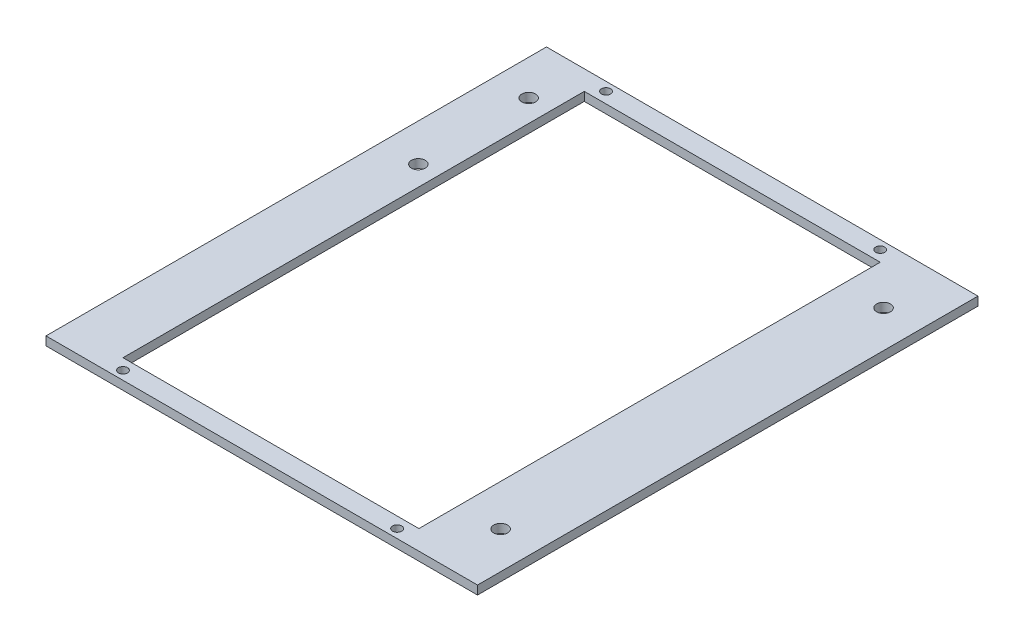
ISO-10303-21;
HEADER;
FILE_DESCRIPTION(('STEP AP214'),'2;1');
FILE_NAME('part.step','',(''),(''),'','','');
FILE_SCHEMA(('AUTOMOTIVE_DESIGN { 1 0 10303 214 1 1 1 1 }'));
ENDSEC;
DATA;
#1=APPLICATION_CONTEXT('core data for automotive mechanical design processes');
#2=APPLICATION_PROTOCOL_DEFINITION('international standard','automotive_design',2000,#1);
#3=PRODUCT_CONTEXT('',#1,'mechanical');
#4=PRODUCT('Part','Part','',(#3));
#5=PRODUCT_RELATED_PRODUCT_CATEGORY('part','',(#4));
#6=PRODUCT_DEFINITION_FORMATION('','',#4);
#7=PRODUCT_DEFINITION_CONTEXT('part definition',#1,'design');
#8=PRODUCT_DEFINITION('design','',#6,#7);
#9=PRODUCT_DEFINITION_SHAPE('','',#8);
#10=(LENGTH_UNIT() NAMED_UNIT(*) SI_UNIT(.MILLI.,.METRE.));
#11=(NAMED_UNIT(*) PLANE_ANGLE_UNIT() SI_UNIT($,.RADIAN.));
#12=(NAMED_UNIT(*) SI_UNIT($,.STERADIAN.) SOLID_ANGLE_UNIT());
#13=UNCERTAINTY_MEASURE_WITH_UNIT(LENGTH_MEASURE(1.E-05),#10,'distance_accuracy_value','');
#14=(GEOMETRIC_REPRESENTATION_CONTEXT(3) GLOBAL_UNCERTAINTY_ASSIGNED_CONTEXT((#13)) GLOBAL_UNIT_ASSIGNED_CONTEXT((#10,
#11,#12)) REPRESENTATION_CONTEXT('',''));
#15=CARTESIAN_POINT('',(0.,0.,0.));
#16=DIRECTION('',(0.,0.,1.));
#17=DIRECTION('',(1.,0.,0.));
#18=AXIS2_PLACEMENT_3D('',#15,#16,#17);
#19=CARTESIAN_POINT('',(0.,2.,4.5));
#20=DIRECTION('',(0.,0.,-1.));
#21=DIRECTION('',(-1.,0.,0.));
#22=AXIS2_PLACEMENT_3D('',#19,#20,#21);
#23=PLANE('',#22);
#24=DIRECTION('',(1.,0.,0.));
#25=VECTOR('',#24,1.);
#26=CARTESIAN_POINT('',(0.,0.,4.5));
#27=LINE('',#26,#25);
#28=CARTESIAN_POINT('',(13.19,0.,4.5));
#29=VERTEX_POINT('',#28);
#30=CARTESIAN_POINT('',(81.19,0.,4.5));
#31=VERTEX_POINT('',#30);
#32=EDGE_CURVE('E191',#29,#31,#27,.T.);
#33=ORIENTED_EDGE('',*,*,#32,.T.);
#34=DIRECTION('',(0.,-1.,0.));
#35=VECTOR('',#34,1.);
#36=CARTESIAN_POINT('',(81.19,2.,4.5));
#37=LINE('',#36,#35);
#38=CARTESIAN_POINT('',(81.19,2.,4.5));
#39=VERTEX_POINT('',#38);
#40=EDGE_CURVE('E11',#39,#31,#37,.T.);
#41=ORIENTED_EDGE('',*,*,#40,.F.);
#42=DIRECTION('',(1.,0.,0.));
#43=VECTOR('',#42,1.);
#44=CARTESIAN_POINT('',(0.,2.,4.5));
#45=LINE('',#44,#43);
#46=CARTESIAN_POINT('',(13.19,2.,4.5));
#47=VERTEX_POINT('',#46);
#48=EDGE_CURVE('E122',#47,#39,#45,.T.);
#49=ORIENTED_EDGE('',*,*,#48,.F.);
#50=DIRECTION('',(0.,-1.,0.));
#51=VECTOR('',#50,1.);
#52=CARTESIAN_POINT('',(13.19,2.,4.5));
#53=LINE('',#52,#51);
#54=EDGE_CURVE('E61',#47,#29,#53,.T.);
#55=ORIENTED_EDGE('',*,*,#54,.T.);
#56=EDGE_LOOP('',(#33,#41,#49,#55));
#57=FACE_BOUND('',#56,.T.);
#58=ADVANCED_FACE('F41',(#57),#23,.F.);
#59=CARTESIAN_POINT('',(81.19,2.,0.));
#60=DIRECTION('',(1.,0.,0.));
#61=DIRECTION('',(0.,0.,-1.));
#62=AXIS2_PLACEMENT_3D('',#59,#60,#61);
#63=PLANE('',#62);
#64=DIRECTION('',(0.,0.,1.));
#65=VECTOR('',#64,1.);
#66=CARTESIAN_POINT('',(81.19,0.,0.));
#67=LINE('',#66,#65);
#68=CARTESIAN_POINT('',(81.19,0.,110.5));
#69=VERTEX_POINT('',#68);
#70=EDGE_CURVE('E129',#31,#69,#67,.T.);
#71=ORIENTED_EDGE('',*,*,#70,.T.);
#72=DIRECTION('',(0.,-1.,0.));
#73=VECTOR('',#72,1.);
#74=CARTESIAN_POINT('',(81.19,2.,110.5));
#75=LINE('',#74,#73);
#76=CARTESIAN_POINT('',(81.19,2.,110.5));
#77=VERTEX_POINT('',#76);
#78=EDGE_CURVE('E52',#77,#69,#75,.T.);
#79=ORIENTED_EDGE('',*,*,#78,.F.);
#80=DIRECTION('',(0.,0.,1.));
#81=VECTOR('',#80,1.);
#82=CARTESIAN_POINT('',(81.19,2.,0.));
#83=LINE('',#82,#81);
#84=EDGE_CURVE('E115',#39,#77,#83,.T.);
#85=ORIENTED_EDGE('',*,*,#84,.F.);
#86=ORIENTED_EDGE('',*,*,#40,.T.);
#87=EDGE_LOOP('',(#71,#79,#85,#86));
#88=FACE_BOUND('',#87,.T.);
#89=ADVANCED_FACE('F128',(#88),#63,.F.);
#90=CARTESIAN_POINT('',(0.,2.,110.5));
#91=DIRECTION('',(0.,0.,-1.));
#92=DIRECTION('',(-1.,0.,0.));
#93=AXIS2_PLACEMENT_3D('',#90,#91,#92);
#94=PLANE('',#93);
#95=DIRECTION('',(1.,0.,0.));
#96=VECTOR('',#95,1.);
#97=CARTESIAN_POINT('',(0.,0.,110.5));
#98=LINE('',#97,#96);
#99=CARTESIAN_POINT('',(13.19,0.,110.5));
#100=VERTEX_POINT('',#99);
#101=EDGE_CURVE('E196',#100,#69,#98,.T.);
#102=ORIENTED_EDGE('',*,*,#101,.F.);
#103=DIRECTION('',(0.,-1.,0.));
#104=VECTOR('',#103,1.);
#105=CARTESIAN_POINT('',(13.19,2.,110.5));
#106=LINE('',#105,#104);
#107=CARTESIAN_POINT('',(13.19,2.,110.5));
#108=VERTEX_POINT('',#107);
#109=EDGE_CURVE('E87',#108,#100,#106,.T.);
#110=ORIENTED_EDGE('',*,*,#109,.F.);
#111=DIRECTION('',(1.,0.,0.));
#112=VECTOR('',#111,1.);
#113=CARTESIAN_POINT('',(0.,2.,110.5));
#114=LINE('',#113,#112);
#115=EDGE_CURVE('E121',#108,#77,#114,.T.);
#116=ORIENTED_EDGE('',*,*,#115,.T.);
#117=ORIENTED_EDGE('',*,*,#78,.T.);
#118=EDGE_LOOP('',(#102,#110,#116,#117));
#119=FACE_BOUND('',#118,.T.);
#120=ADVANCED_FACE('F134',(#119),#94,.T.);
#121=CARTESIAN_POINT('',(99.16,2.,0.));
#122=DIRECTION('',(1.,0.,0.));
#123=DIRECTION('',(0.,0.,-1.));
#124=AXIS2_PLACEMENT_3D('',#121,#122,#123);
#125=PLANE('',#124);
#126=DIRECTION('',(0.,0.,1.));
#127=VECTOR('',#126,1.);
#128=CARTESIAN_POINT('',(99.16,0.,0.));
#129=LINE('',#128,#127);
#130=CARTESIAN_POINT('',(99.16,0.,0.));
#131=VERTEX_POINT('',#130);
#132=CARTESIAN_POINT('',(99.16,0.,115.));
#133=VERTEX_POINT('',#132);
#134=EDGE_CURVE('E175',#131,#133,#129,.T.);
#135=ORIENTED_EDGE('',*,*,#134,.F.);
#136=DIRECTION('',(0.,-1.,0.));
#137=VECTOR('',#136,1.);
#138=CARTESIAN_POINT('',(99.16,2.,0.));
#139=LINE('',#138,#137);
#140=CARTESIAN_POINT('',(99.16,2.,0.));
#141=VERTEX_POINT('',#140);
#142=EDGE_CURVE('E45',#141,#131,#139,.T.);
#143=ORIENTED_EDGE('',*,*,#142,.F.);
#144=DIRECTION('',(0.,0.,1.));
#145=VECTOR('',#144,1.);
#146=CARTESIAN_POINT('',(99.16,2.,0.));
#147=LINE('',#146,#145);
#148=CARTESIAN_POINT('',(99.16,2.,115.));
#149=VERTEX_POINT('',#148);
#150=EDGE_CURVE('E251',#141,#149,#147,.T.);
#151=ORIENTED_EDGE('',*,*,#150,.T.);
#152=DIRECTION('',(0.,-1.,0.));
#153=VECTOR('',#152,1.);
#154=CARTESIAN_POINT('',(99.16,2.,115.));
#155=LINE('',#154,#153);
#156=EDGE_CURVE('E150',#149,#133,#155,.T.);
#157=ORIENTED_EDGE('',*,*,#156,.T.);
#158=EDGE_LOOP('',(#135,#143,#151,#157));
#159=FACE_BOUND('',#158,.T.);
#160=ADVANCED_FACE('F233',(#159),#125,.T.);
#161=CARTESIAN_POINT('',(0.,2.,0.));
#162=DIRECTION('',(0.,0.,-1.));
#163=DIRECTION('',(-1.,0.,0.));
#164=AXIS2_PLACEMENT_3D('',#161,#162,#163);
#165=PLANE('',#164);
#166=DIRECTION('',(1.,0.,0.));
#167=VECTOR('',#166,1.);
#168=CARTESIAN_POINT('',(0.,0.,0.));
#169=LINE('',#168,#167);
#170=CARTESIAN_POINT('',(0.,0.,0.));
#171=VERTEX_POINT('',#170);
#172=EDGE_CURVE('E179',#171,#131,#169,.T.);
#173=ORIENTED_EDGE('',*,*,#172,.F.);
#174=DIRECTION('',(0.,-1.,0.));
#175=VECTOR('',#174,1.);
#176=CARTESIAN_POINT('',(0.,2.,0.));
#177=LINE('',#176,#175);
#178=CARTESIAN_POINT('',(0.,2.,0.));
#179=VERTEX_POINT('',#178);
#180=EDGE_CURVE('E221',#179,#171,#177,.T.);
#181=ORIENTED_EDGE('',*,*,#180,.F.);
#182=DIRECTION('',(1.,0.,0.));
#183=VECTOR('',#182,1.);
#184=CARTESIAN_POINT('',(0.,2.,0.));
#185=LINE('',#184,#183);
#186=EDGE_CURVE('E232',#179,#141,#185,.T.);
#187=ORIENTED_EDGE('',*,*,#186,.T.);
#188=ORIENTED_EDGE('',*,*,#142,.T.);
#189=EDGE_LOOP('',(#173,#181,#187,#188));
#190=FACE_BOUND('',#189,.T.);
#191=ADVANCED_FACE('F230',(#190),#165,.T.);
#192=CARTESIAN_POINT('',(0.,2.,0.));
#193=DIRECTION('',(1.,0.,0.));
#194=DIRECTION('',(0.,0.,-1.));
#195=AXIS2_PLACEMENT_3D('',#192,#193,#194);
#196=PLANE('',#195);
#197=DIRECTION('',(0.,0.,1.));
#198=VECTOR('',#197,1.);
#199=CARTESIAN_POINT('',(0.,0.,0.));
#200=LINE('',#199,#198);
#201=CARTESIAN_POINT('',(0.,0.,115.));
#202=VERTEX_POINT('',#201);
#203=EDGE_CURVE('E183',#171,#202,#200,.T.);
#204=ORIENTED_EDGE('',*,*,#203,.T.);
#205=DIRECTION('',(0.,-1.,0.));
#206=VECTOR('',#205,1.);
#207=CARTESIAN_POINT('',(0.,2.,115.));
#208=LINE('',#207,#206);
#209=CARTESIAN_POINT('',(0.,2.,115.));
#210=VERTEX_POINT('',#209);
#211=EDGE_CURVE('E218',#210,#202,#208,.T.);
#212=ORIENTED_EDGE('',*,*,#211,.F.);
#213=DIRECTION('',(0.,0.,1.));
#214=VECTOR('',#213,1.);
#215=CARTESIAN_POINT('',(0.,2.,0.));
#216=LINE('',#215,#214);
#217=EDGE_CURVE('E241',#179,#210,#216,.T.);
#218=ORIENTED_EDGE('',*,*,#217,.F.);
#219=ORIENTED_EDGE('',*,*,#180,.T.);
#220=EDGE_LOOP('',(#204,#212,#218,#219));
#221=FACE_BOUND('',#220,.T.);
#222=ADVANCED_FACE('F239',(#221),#196,.F.);
#223=CARTESIAN_POINT('',(8.61999999999999,2.,38.06));
#224=DIRECTION('',(0.,-1.,0.));
#225=DIRECTION('',(0.,0.,-1.));
#226=AXIS2_PLACEMENT_3D('',#223,#224,#225);
#227=CYLINDRICAL_SURFACE('',#226,1.58499999999999);
#228=CARTESIAN_POINT('',(8.61999999999999,2.,38.06));
#229=DIRECTION('',(0.,1.,0.));
#230=DIRECTION('',(0.,0.,1.));
#231=AXIS2_PLACEMENT_3D('',#228,#229,#230);
#232=CIRCLE('',#231,1.58499999999999);
#233=CARTESIAN_POINT('',(8.61999999999999,2.,39.645));
#234=VERTEX_POINT('',#233);
#235=EDGE_CURVE('E139',#234,#234,#232,.T.);
#236=ORIENTED_EDGE('',*,*,#235,.T.);
#237=EDGE_LOOP('',(#236));
#238=FACE_BOUND('',#237,.T.);
#239=CARTESIAN_POINT('',(8.61999999999999,0.,38.06));
#240=DIRECTION('',(0.,1.,0.));
#241=DIRECTION('',(0.,0.,1.));
#242=AXIS2_PLACEMENT_3D('',#239,#240,#241);
#243=CIRCLE('',#242,1.58499999999999);
#244=CARTESIAN_POINT('',(8.61999999999999,0.,39.645));
#245=VERTEX_POINT('',#244);
#246=EDGE_CURVE('E203',#245,#245,#243,.T.);
#247=ORIENTED_EDGE('',*,*,#246,.F.);
#248=EDGE_LOOP('',(#247));
#249=FACE_BOUND('',#248,.T.);
#250=ADVANCED_FACE('F324',(#238,#249),#227,.F.);
#251=CARTESIAN_POINT('',(13.19,2.,0.));
#252=DIRECTION('',(1.,0.,0.));
#253=DIRECTION('',(0.,0.,-1.));
#254=AXIS2_PLACEMENT_3D('',#251,#252,#253);
#255=PLANE('',#254);
#256=DIRECTION('',(0.,0.,1.));
#257=VECTOR('',#256,1.);
#258=CARTESIAN_POINT('',(13.19,0.,0.));
#259=LINE('',#258,#257);
#260=EDGE_CURVE('E199',#29,#100,#259,.T.);
#261=ORIENTED_EDGE('',*,*,#260,.F.);
#262=ORIENTED_EDGE('',*,*,#54,.F.);
#263=DIRECTION('',(0.,0.,1.));
#264=VECTOR('',#263,1.);
#265=CARTESIAN_POINT('',(13.19,2.,0.));
#266=LINE('',#265,#264);
#267=EDGE_CURVE('E136',#47,#108,#266,.T.);
#268=ORIENTED_EDGE('',*,*,#267,.T.);
#269=ORIENTED_EDGE('',*,*,#109,.T.);
#270=EDGE_LOOP('',(#261,#262,#268,#269));
#271=FACE_BOUND('',#270,.T.);
#272=ADVANCED_FACE('F321',(#271),#255,.T.);
#273=CARTESIAN_POINT('',(0.,2.,115.));
#274=DIRECTION('',(0.,0.,-1.));
#275=DIRECTION('',(-1.,0.,0.));
#276=AXIS2_PLACEMENT_3D('',#273,#274,#275);
#277=PLANE('',#276);
#278=DIRECTION('',(1.,0.,0.));
#279=VECTOR('',#278,1.);
#280=CARTESIAN_POINT('',(0.,0.,115.));
#281=LINE('',#280,#279);
#282=EDGE_CURVE('E187',#202,#133,#281,.T.);
#283=ORIENTED_EDGE('',*,*,#282,.T.);
#284=ORIENTED_EDGE('',*,*,#156,.F.);
#285=DIRECTION('',(1.,0.,0.));
#286=VECTOR('',#285,1.);
#287=CARTESIAN_POINT('',(0.,2.,115.));
#288=LINE('',#287,#286);
#289=EDGE_CURVE('E244',#210,#149,#288,.T.);
#290=ORIENTED_EDGE('',*,*,#289,.F.);
#291=ORIENTED_EDGE('',*,*,#211,.T.);
#292=EDGE_LOOP('',(#283,#284,#290,#291));
#293=FACE_BOUND('',#292,.T.);
#294=ADVANCED_FACE('F243',(#293),#277,.F.);
#295=CARTESIAN_POINT('',(90.66,2.,13.2));
#296=DIRECTION('',(0.,-1.,0.));
#297=DIRECTION('',(0.,0.,-1.));
#298=AXIS2_PLACEMENT_3D('',#295,#296,#297);
#299=CYLINDRICAL_SURFACE('',#298,1.58499999999999);
#300=CARTESIAN_POINT('',(90.66,2.,13.2));
#301=DIRECTION('',(0.,1.,0.));
#302=DIRECTION('',(0.,0.,1.));
#303=AXIS2_PLACEMENT_3D('',#300,#301,#302);
#304=CIRCLE('',#303,1.58499999999999);
#305=CARTESIAN_POINT('',(90.66,2.,14.785));
#306=VERTEX_POINT('',#305);
#307=EDGE_CURVE('E257',#306,#306,#304,.T.);
#308=ORIENTED_EDGE('',*,*,#307,.T.);
#309=EDGE_LOOP('',(#308));
#310=FACE_BOUND('',#309,.T.);
#311=CARTESIAN_POINT('',(90.66,0.,13.2));
#312=DIRECTION('',(0.,1.,0.));
#313=DIRECTION('',(0.,0.,1.));
#314=AXIS2_PLACEMENT_3D('',#311,#312,#313);
#315=CIRCLE('',#314,1.58499999999999);
#316=CARTESIAN_POINT('',(90.66,0.,14.785));
#317=VERTEX_POINT('',#316);
#318=EDGE_CURVE('E171',#317,#317,#315,.T.);
#319=ORIENTED_EDGE('',*,*,#318,.F.);
#320=EDGE_LOOP('',(#319));
#321=FACE_BOUND('',#320,.T.);
#322=ADVANCED_FACE('F297',(#310,#321),#299,.F.);
#323=CARTESIAN_POINT('',(90.66,2.,101.2));
#324=DIRECTION('',(0.,-1.,0.));
#325=DIRECTION('',(0.,0.,-1.));
#326=AXIS2_PLACEMENT_3D('',#323,#324,#325);
#327=CYLINDRICAL_SURFACE('',#326,1.58499999999999);
#328=CARTESIAN_POINT('',(90.66,2.,101.2));
#329=DIRECTION('',(0.,1.,0.));
#330=DIRECTION('',(0.,0.,1.));
#331=AXIS2_PLACEMENT_3D('',#328,#329,#330);
#332=CIRCLE('',#331,1.58499999999999);
#333=CARTESIAN_POINT('',(90.66,2.,102.785));
#334=VERTEX_POINT('',#333);
#335=EDGE_CURVE('E261',#334,#334,#332,.T.);
#336=ORIENTED_EDGE('',*,*,#335,.T.);
#337=EDGE_LOOP('',(#336));
#338=FACE_BOUND('',#337,.T.);
#339=CARTESIAN_POINT('',(90.66,0.,101.2));
#340=DIRECTION('',(0.,1.,0.));
#341=DIRECTION('',(0.,0.,1.));
#342=AXIS2_PLACEMENT_3D('',#339,#340,#341);
#343=CIRCLE('',#342,1.58499999999999);
#344=CARTESIAN_POINT('',(90.66,0.,102.785));
#345=VERTEX_POINT('',#344);
#346=EDGE_CURVE('E167',#345,#345,#343,.T.);
#347=ORIENTED_EDGE('',*,*,#346,.F.);
#348=EDGE_LOOP('',(#347));
#349=FACE_BOUND('',#348,.T.);
#350=ADVANCED_FACE('F300',(#338,#349),#327,.F.);
#351=CARTESIAN_POINT('',(15.69,2.,2.));
#352=DIRECTION('',(0.,-1.,0.));
#353=DIRECTION('',(0.,0.,-1.));
#354=AXIS2_PLACEMENT_3D('',#351,#352,#353);
#355=CYLINDRICAL_SURFACE('',#354,1.04999999999999);
#356=CARTESIAN_POINT('',(15.69,2.,2.));
#357=DIRECTION('',(0.,1.,0.));
#358=DIRECTION('',(0.,0.,1.));
#359=AXIS2_PLACEMENT_3D('',#356,#357,#358);
#360=CIRCLE('',#359,1.04999999999999);
#361=CARTESIAN_POINT('',(15.69,2.,3.04999999999999));
#362=VERTEX_POINT('',#361);
#363=EDGE_CURVE('E265',#362,#362,#360,.T.);
#364=ORIENTED_EDGE('',*,*,#363,.T.);
#365=EDGE_LOOP('',(#364));
#366=FACE_BOUND('',#365,.T.);
#367=CARTESIAN_POINT('',(15.69,0.,2.));
#368=DIRECTION('',(0.,1.,0.));
#369=DIRECTION('',(0.,0.,1.));
#370=AXIS2_PLACEMENT_3D('',#367,#368,#369);
#371=CIRCLE('',#370,1.04999999999999);
#372=CARTESIAN_POINT('',(15.69,0.,3.04999999999999));
#373=VERTEX_POINT('',#372);
#374=EDGE_CURVE('E163',#373,#373,#371,.T.);
#375=ORIENTED_EDGE('',*,*,#374,.F.);
#376=EDGE_LOOP('',(#375));
#377=FACE_BOUND('',#376,.T.);
#378=ADVANCED_FACE('F331',(#366,#377),#355,.F.);
#379=CARTESIAN_POINT('',(78.69,2.,2.));
#380=DIRECTION('',(0.,-1.,0.));
#381=DIRECTION('',(0.,0.,-1.));
#382=AXIS2_PLACEMENT_3D('',#379,#380,#381);
#383=CYLINDRICAL_SURFACE('',#382,1.04999999999999);
#384=CARTESIAN_POINT('',(78.69,2.,2.));
#385=DIRECTION('',(0.,1.,0.));
#386=DIRECTION('',(0.,0.,1.));
#387=AXIS2_PLACEMENT_3D('',#384,#385,#386);
#388=CIRCLE('',#387,1.04999999999999);
#389=CARTESIAN_POINT('',(78.69,2.,3.04999999999999));
#390=VERTEX_POINT('',#389);
#391=EDGE_CURVE('E269',#390,#390,#388,.T.);
#392=ORIENTED_EDGE('',*,*,#391,.T.);
#393=EDGE_LOOP('',(#392));
#394=FACE_BOUND('',#393,.T.);
#395=CARTESIAN_POINT('',(78.69,0.,2.));
#396=DIRECTION('',(0.,1.,0.));
#397=DIRECTION('',(0.,0.,1.));
#398=AXIS2_PLACEMENT_3D('',#395,#396,#397);
#399=CIRCLE('',#398,1.04999999999999);
#400=CARTESIAN_POINT('',(78.69,0.,3.04999999999999));
#401=VERTEX_POINT('',#400);
#402=EDGE_CURVE('E159',#401,#401,#399,.T.);
#403=ORIENTED_EDGE('',*,*,#402,.F.);
#404=EDGE_LOOP('',(#403));
#405=FACE_BOUND('',#404,.T.);
#406=ADVANCED_FACE('F335',(#394,#405),#383,.F.);
#407=CARTESIAN_POINT('',(15.69,2.,113.));
#408=DIRECTION('',(0.,-1.,0.));
#409=DIRECTION('',(0.,0.,-1.));
#410=AXIS2_PLACEMENT_3D('',#407,#408,#409);
#411=CYLINDRICAL_SURFACE('',#410,1.04999999999999);
#412=CARTESIAN_POINT('',(15.69,2.,113.));
#413=DIRECTION('',(0.,1.,0.));
#414=DIRECTION('',(0.,0.,1.));
#415=AXIS2_PLACEMENT_3D('',#412,#413,#414);
#416=CIRCLE('',#415,1.04999999999999);
#417=CARTESIAN_POINT('',(15.69,2.,114.05));
#418=VERTEX_POINT('',#417);
#419=EDGE_CURVE('E273',#418,#418,#416,.T.);
#420=ORIENTED_EDGE('',*,*,#419,.T.);
#421=EDGE_LOOP('',(#420));
#422=FACE_BOUND('',#421,.T.);
#423=CARTESIAN_POINT('',(15.69,0.,113.));
#424=DIRECTION('',(0.,1.,0.));
#425=DIRECTION('',(0.,0.,1.));
#426=AXIS2_PLACEMENT_3D('',#423,#424,#425);
#427=CIRCLE('',#426,1.04999999999999);
#428=CARTESIAN_POINT('',(15.69,0.,114.05));
#429=VERTEX_POINT('',#428);
#430=EDGE_CURVE('E155',#429,#429,#427,.T.);
#431=ORIENTED_EDGE('',*,*,#430,.F.);
#432=EDGE_LOOP('',(#431));
#433=FACE_BOUND('',#432,.T.);
#434=ADVANCED_FACE('F338',(#422,#433),#411,.F.);
#435=CARTESIAN_POINT('',(78.69,2.,113.));
#436=DIRECTION('',(0.,-1.,0.));
#437=DIRECTION('',(0.,0.,-1.));
#438=AXIS2_PLACEMENT_3D('',#435,#436,#437);
#439=CYLINDRICAL_SURFACE('',#438,1.04999999999999);
#440=CARTESIAN_POINT('',(78.69,2.,113.));
#441=DIRECTION('',(0.,1.,0.));
#442=DIRECTION('',(0.,0.,1.));
#443=AXIS2_PLACEMENT_3D('',#440,#441,#442);
#444=CIRCLE('',#443,1.04999999999999);
#445=CARTESIAN_POINT('',(78.69,2.,114.05));
#446=VERTEX_POINT('',#445);
#447=EDGE_CURVE('E211',#446,#446,#444,.T.);
#448=ORIENTED_EDGE('',*,*,#447,.T.);
#449=EDGE_LOOP('',(#448));
#450=FACE_BOUND('',#449,.T.);
#451=CARTESIAN_POINT('',(78.69,0.,113.));
#452=DIRECTION('',(0.,1.,0.));
#453=DIRECTION('',(0.,0.,1.));
#454=AXIS2_PLACEMENT_3D('',#451,#452,#453);
#455=CIRCLE('',#454,1.04999999999999);
#456=CARTESIAN_POINT('',(78.69,0.,114.05));
#457=VERTEX_POINT('',#456);
#458=EDGE_CURVE('E151',#457,#457,#455,.T.);
#459=ORIENTED_EDGE('',*,*,#458,.F.);
#460=EDGE_LOOP('',(#459));
#461=FACE_BOUND('',#460,.T.);
#462=ADVANCED_FACE('F43',(#450,#461),#439,.F.);
#463=CARTESIAN_POINT('',(8.11999999999999,2.,12.2));
#464=DIRECTION('',(0.,-1.,0.));
#465=DIRECTION('',(0.,0.,-1.));
#466=AXIS2_PLACEMENT_3D('',#463,#464,#465);
#467=CYLINDRICAL_SURFACE('',#466,1.58499999999999);
#468=CARTESIAN_POINT('',(8.11999999999999,2.,12.2));
#469=DIRECTION('',(0.,1.,0.));
#470=DIRECTION('',(0.,0.,1.));
#471=AXIS2_PLACEMENT_3D('',#468,#469,#470);
#472=CIRCLE('',#471,1.58499999999999);
#473=CARTESIAN_POINT('',(8.11999999999999,2.,13.785));
#474=VERTEX_POINT('',#473);
#475=EDGE_CURVE('E146',#474,#474,#472,.T.);
#476=ORIENTED_EDGE('',*,*,#475,.T.);
#477=EDGE_LOOP('',(#476));
#478=FACE_BOUND('',#477,.T.);
#479=CARTESIAN_POINT('',(8.11999999999999,0.,12.2));
#480=DIRECTION('',(0.,1.,0.));
#481=DIRECTION('',(0.,0.,1.));
#482=AXIS2_PLACEMENT_3D('',#479,#480,#481);
#483=CIRCLE('',#482,1.58499999999999);
#484=CARTESIAN_POINT('',(8.11999999999999,0.,13.785));
#485=VERTEX_POINT('',#484);
#486=EDGE_CURVE('E207',#485,#485,#483,.T.);
#487=ORIENTED_EDGE('',*,*,#486,.F.);
#488=EDGE_LOOP('',(#487));
#489=FACE_BOUND('',#488,.T.);
#490=ADVANCED_FACE('F285',(#478,#489),#467,.F.);
#491=CARTESIAN_POINT('',(0.,2.,0.));
#492=DIRECTION('',(0.,1.,0.));
#493=DIRECTION('',(0.,0.,1.));
#494=AXIS2_PLACEMENT_3D('',#491,#492,#493);
#495=PLANE('',#494);
#496=ORIENTED_EDGE('',*,*,#447,.F.);
#497=EDGE_LOOP('',(#496));
#498=FACE_BOUND('',#497,.T.);
#499=ORIENTED_EDGE('',*,*,#419,.F.);
#500=EDGE_LOOP('',(#499));
#501=FACE_BOUND('',#500,.T.);
#502=ORIENTED_EDGE('',*,*,#391,.F.);
#503=EDGE_LOOP('',(#502));
#504=FACE_BOUND('',#503,.T.);
#505=ORIENTED_EDGE('',*,*,#363,.F.);
#506=EDGE_LOOP('',(#505));
#507=FACE_BOUND('',#506,.T.);
#508=ORIENTED_EDGE('',*,*,#335,.F.);
#509=EDGE_LOOP('',(#508));
#510=FACE_BOUND('',#509,.T.);
#511=ORIENTED_EDGE('',*,*,#307,.F.);
#512=EDGE_LOOP('',(#511));
#513=FACE_BOUND('',#512,.T.);
#514=ORIENTED_EDGE('',*,*,#150,.F.);
#515=ORIENTED_EDGE('',*,*,#186,.F.);
#516=ORIENTED_EDGE('',*,*,#217,.T.);
#517=ORIENTED_EDGE('',*,*,#289,.T.);
#518=EDGE_LOOP('',(#514,#515,#516,#517));
#519=FACE_BOUND('',#518,.T.);
#520=ORIENTED_EDGE('',*,*,#48,.T.);
#521=ORIENTED_EDGE('',*,*,#84,.T.);
#522=ORIENTED_EDGE('',*,*,#115,.F.);
#523=ORIENTED_EDGE('',*,*,#267,.F.);
#524=EDGE_LOOP('',(#520,#521,#522,#523));
#525=FACE_BOUND('',#524,.T.);
#526=ORIENTED_EDGE('',*,*,#235,.F.);
#527=EDGE_LOOP('',(#526));
#528=FACE_BOUND('',#527,.T.);
#529=ORIENTED_EDGE('',*,*,#475,.F.);
#530=EDGE_LOOP('',(#529));
#531=FACE_BOUND('',#530,.T.);
#532=ADVANCED_FACE('F117',(#498,#501,#504,#507,#510,#513,#519,#525,#528,#531),#495,.T.);
#533=CARTESIAN_POINT('',(0.,0.,0.));
#534=DIRECTION('',(0.,1.,0.));
#535=DIRECTION('',(0.,0.,1.));
#536=AXIS2_PLACEMENT_3D('',#533,#534,#535);
#537=PLANE('',#536);
#538=ORIENTED_EDGE('',*,*,#458,.T.);
#539=EDGE_LOOP('',(#538));
#540=FACE_BOUND('',#539,.T.);
#541=ORIENTED_EDGE('',*,*,#430,.T.);
#542=EDGE_LOOP('',(#541));
#543=FACE_BOUND('',#542,.T.);
#544=ORIENTED_EDGE('',*,*,#402,.T.);
#545=EDGE_LOOP('',(#544));
#546=FACE_BOUND('',#545,.T.);
#547=ORIENTED_EDGE('',*,*,#374,.T.);
#548=EDGE_LOOP('',(#547));
#549=FACE_BOUND('',#548,.T.);
#550=ORIENTED_EDGE('',*,*,#346,.T.);
#551=EDGE_LOOP('',(#550));
#552=FACE_BOUND('',#551,.T.);
#553=ORIENTED_EDGE('',*,*,#318,.T.);
#554=EDGE_LOOP('',(#553));
#555=FACE_BOUND('',#554,.T.);
#556=ORIENTED_EDGE('',*,*,#134,.T.);
#557=ORIENTED_EDGE('',*,*,#282,.F.);
#558=ORIENTED_EDGE('',*,*,#203,.F.);
#559=ORIENTED_EDGE('',*,*,#172,.T.);
#560=EDGE_LOOP('',(#556,#557,#558,#559));
#561=FACE_BOUND('',#560,.T.);
#562=ORIENTED_EDGE('',*,*,#32,.F.);
#563=ORIENTED_EDGE('',*,*,#260,.T.);
#564=ORIENTED_EDGE('',*,*,#101,.T.);
#565=ORIENTED_EDGE('',*,*,#70,.F.);
#566=EDGE_LOOP('',(#562,#563,#564,#565));
#567=FACE_BOUND('',#566,.T.);
#568=ORIENTED_EDGE('',*,*,#246,.T.);
#569=EDGE_LOOP('',(#568));
#570=FACE_BOUND('',#569,.T.);
#571=ORIENTED_EDGE('',*,*,#486,.T.);
#572=EDGE_LOOP('',(#571));
#573=FACE_BOUND('',#572,.T.);
#574=ADVANCED_FACE('F236',(#540,#543,#546,#549,#552,#555,#561,#567,#570,#573),#537,.F.);
#575=CLOSED_SHELL('',(#58,#89,#120,#160,#191,#222,#250,#272,#294,#322,#350,#378,#406,#434,#462,
#490,#532,#574));
#576=MANIFOLD_SOLID_BREP('B2',#575);
#577=ADVANCED_BREP_SHAPE_REPRESENTATION('',(#18,#576),#14);
#578=SHAPE_DEFINITION_REPRESENTATION(#9,#577);
ENDSEC;
END-ISO-10303-21;
